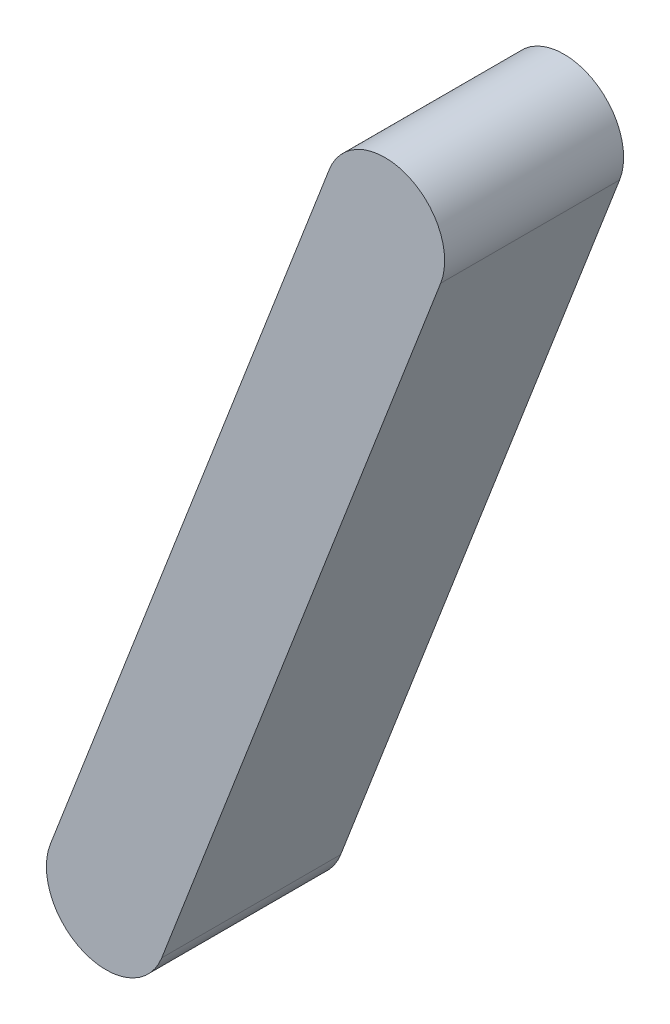
ISO-10303-21;
HEADER;
FILE_DESCRIPTION(('STEP AP214'),'2;1');
FILE_NAME('part.step','',(''),(''),'','','');
FILE_SCHEMA(('AUTOMOTIVE_DESIGN { 1 0 10303 214 1 1 1 1 }'));
ENDSEC;
DATA;
#1=APPLICATION_CONTEXT('core data for automotive mechanical design processes');
#2=APPLICATION_PROTOCOL_DEFINITION('international standard','automotive_design',2000,#1);
#3=PRODUCT_CONTEXT('',#1,'mechanical');
#4=PRODUCT('Part','Part','',(#3));
#5=PRODUCT_RELATED_PRODUCT_CATEGORY('part','',(#4));
#6=PRODUCT_DEFINITION_FORMATION('','',#4);
#7=PRODUCT_DEFINITION_CONTEXT('part definition',#1,'design');
#8=PRODUCT_DEFINITION('design','',#6,#7);
#9=PRODUCT_DEFINITION_SHAPE('','',#8);
#10=(LENGTH_UNIT() NAMED_UNIT(*) SI_UNIT(.MILLI.,.METRE.));
#11=(NAMED_UNIT(*) PLANE_ANGLE_UNIT() SI_UNIT($,.RADIAN.));
#12=(NAMED_UNIT(*) SI_UNIT($,.STERADIAN.) SOLID_ANGLE_UNIT());
#13=UNCERTAINTY_MEASURE_WITH_UNIT(LENGTH_MEASURE(1.E-05),#10,'distance_accuracy_value','');
#14=(GEOMETRIC_REPRESENTATION_CONTEXT(3) GLOBAL_UNCERTAINTY_ASSIGNED_CONTEXT((#13)) GLOBAL_UNIT_ASSIGNED_CONTEXT((#10,
#11,#12)) REPRESENTATION_CONTEXT('',''));
#15=CARTESIAN_POINT('',(0.,0.,0.));
#16=DIRECTION('',(0.,0.,1.));
#17=DIRECTION('',(1.,0.,0.));
#18=AXIS2_PLACEMENT_3D('',#15,#16,#17);
#19=CARTESIAN_POINT('',(-17.2604125977252,-48.0176499051361,15.));
#20=DIRECTION('',(0.,0.,-1.));
#21=DIRECTION('',(-1.,0.,0.));
#22=AXIS2_PLACEMENT_3D('',#19,#20,#21);
#23=CYLINDRICAL_SURFACE('',#22,10.);
#24=CARTESIAN_POINT('',(-17.2604125977252,-48.0176499051361,-15.));
#25=DIRECTION('',(0.,0.,1.));
#26=DIRECTION('',(1.,0.,0.));
#27=AXIS2_PLACEMENT_3D('',#24,#25,#26);
#28=CIRCLE('',#27,10.);
#29=CARTESIAN_POINT('',(-26.5913391389211,-44.4212892609839,-15.));
#30=VERTEX_POINT('',#29);
#31=CARTESIAN_POINT('',(-7.92948605652935,-51.6140105492883,-15.));
#32=VERTEX_POINT('',#31);
#33=EDGE_CURVE('E95',#30,#32,#28,.T.);
#34=ORIENTED_EDGE('',*,*,#33,.T.);
#35=DIRECTION('',(0.,0.,-1.));
#36=VECTOR('',#35,1.);
#37=CARTESIAN_POINT('',(-7.92948605652935,-51.6140105492883,15.));
#38=LINE('',#37,#36);
#39=CARTESIAN_POINT('',(-7.92948605652935,-51.6140105492883,15.));
#40=VERTEX_POINT('',#39);
#41=EDGE_CURVE('E11',#40,#32,#38,.T.);
#42=ORIENTED_EDGE('',*,*,#41,.F.);
#43=CARTESIAN_POINT('',(-17.2604125977252,-48.0176499051361,15.));
#44=DIRECTION('',(0.,0.,1.));
#45=DIRECTION('',(1.,0.,0.));
#46=AXIS2_PLACEMENT_3D('',#43,#44,#45);
#47=CIRCLE('',#46,10.);
#48=CARTESIAN_POINT('',(-26.5913391389211,-44.4212892609839,15.));
#49=VERTEX_POINT('',#48);
#50=EDGE_CURVE('E83',#49,#40,#47,.T.);
#51=ORIENTED_EDGE('',*,*,#50,.F.);
#52=DIRECTION('',(0.,0.,-1.));
#53=VECTOR('',#52,1.);
#54=CARTESIAN_POINT('',(-26.5913391389211,-44.4212892609839,15.));
#55=LINE('',#54,#53);
#56=EDGE_CURVE('E91',#49,#30,#55,.T.);
#57=ORIENTED_EDGE('',*,*,#56,.T.);
#58=EDGE_LOOP('',(#34,#42,#51,#57));
#59=FACE_BOUND('',#58,.T.);
#60=ADVANCED_FACE('F32',(#59),#23,.T.);
#61=CARTESIAN_POINT('',(-7.92948605652935,-51.6140105492883,15.));
#62=DIRECTION('',(-0.933092654119586,0.359636064415218,0.));
#63=DIRECTION('',(-0.359636064415218,-0.933092654119586,0.));
#64=AXIS2_PLACEMENT_3D('',#61,#62,#63);
#65=PLANE('',#64);
#66=DIRECTION('',(0.359636064415218,0.933092654119586,0.));
#67=VECTOR('',#66,1.);
#68=CARTESIAN_POINT('',(-7.92948605652935,-51.6140105492883,-15.));
#69=LINE('',#68,#67);
#70=CARTESIAN_POINT('',(38.823202317449,69.6880344862579,-15.));
#71=VERTEX_POINT('',#70);
#72=EDGE_CURVE('E87',#32,#71,#69,.T.);
#73=ORIENTED_EDGE('',*,*,#72,.T.);
#74=DIRECTION('',(0.,0.,-1.));
#75=VECTOR('',#74,1.);
#76=CARTESIAN_POINT('',(38.823202317449,69.6880344862579,15.));
#77=LINE('',#76,#75);
#78=CARTESIAN_POINT('',(38.823202317449,69.6880344862579,15.));
#79=VERTEX_POINT('',#78);
#80=EDGE_CURVE('E40',#79,#71,#77,.T.);
#81=ORIENTED_EDGE('',*,*,#80,.F.);
#82=DIRECTION('',(0.359636064415218,0.933092654119586,0.));
#83=VECTOR('',#82,1.);
#84=CARTESIAN_POINT('',(-7.92948605652935,-51.6140105492883,15.));
#85=LINE('',#84,#83);
#86=EDGE_CURVE('E78',#40,#79,#85,.T.);
#87=ORIENTED_EDGE('',*,*,#86,.F.);
#88=ORIENTED_EDGE('',*,*,#41,.T.);
#89=EDGE_LOOP('',(#73,#81,#87,#88));
#90=FACE_BOUND('',#89,.T.);
#91=ADVANCED_FACE('F86',(#90),#65,.F.);
#92=CARTESIAN_POINT('',(29.4922757762531,73.2843951304101,15.));
#93=DIRECTION('',(0.,0.,-1.));
#94=DIRECTION('',(-1.,0.,0.));
#95=AXIS2_PLACEMENT_3D('',#92,#93,#94);
#96=CYLINDRICAL_SURFACE('',#95,9.99999999999999);
#97=CARTESIAN_POINT('',(29.4922757762531,73.2843951304101,-15.));
#98=DIRECTION('',(0.,0.,1.));
#99=DIRECTION('',(1.,0.,0.));
#100=AXIS2_PLACEMENT_3D('',#97,#98,#99);
#101=CIRCLE('',#100,9.99999999999999);
#102=CARTESIAN_POINT('',(20.1613492350573,76.8807557745623,-15.));
#103=VERTEX_POINT('',#102);
#104=EDGE_CURVE('E65',#71,#103,#101,.T.);
#105=ORIENTED_EDGE('',*,*,#104,.T.);
#106=DIRECTION('',(0.,0.,-1.));
#107=VECTOR('',#106,1.);
#108=CARTESIAN_POINT('',(20.1613492350573,76.8807557745623,15.));
#109=LINE('',#108,#107);
#110=CARTESIAN_POINT('',(20.1613492350573,76.8807557745623,15.));
#111=VERTEX_POINT('',#110);
#112=EDGE_CURVE('E88',#111,#103,#109,.T.);
#113=ORIENTED_EDGE('',*,*,#112,.F.);
#114=CARTESIAN_POINT('',(29.4922757762531,73.2843951304101,15.));
#115=DIRECTION('',(0.,0.,1.));
#116=DIRECTION('',(1.,0.,0.));
#117=AXIS2_PLACEMENT_3D('',#114,#115,#116);
#118=CIRCLE('',#117,9.99999999999999);
#119=EDGE_CURVE('E81',#79,#111,#118,.T.);
#120=ORIENTED_EDGE('',*,*,#119,.F.);
#121=ORIENTED_EDGE('',*,*,#80,.T.);
#122=EDGE_LOOP('',(#105,#113,#120,#121));
#123=FACE_BOUND('',#122,.T.);
#124=ADVANCED_FACE('F89',(#123),#96,.T.);
#125=CARTESIAN_POINT('',(-26.5913391389211,-44.4212892609839,15.));
#126=DIRECTION('',(0.933092654119586,-0.359636064415218,0.));
#127=DIRECTION('',(0.359636064415218,0.933092654119586,0.));
#128=AXIS2_PLACEMENT_3D('',#125,#126,#127);
#129=PLANE('',#128);
#130=DIRECTION('',(-0.359636064415218,-0.933092654119586,0.));
#131=VECTOR('',#130,1.);
#132=CARTESIAN_POINT('',(-26.5913391389211,-44.4212892609839,-15.));
#133=LINE('',#132,#131);
#134=EDGE_CURVE('E71',#103,#30,#133,.T.);
#135=ORIENTED_EDGE('',*,*,#134,.T.);
#136=ORIENTED_EDGE('',*,*,#56,.F.);
#137=DIRECTION('',(-0.359636064415218,-0.933092654119586,0.));
#138=VECTOR('',#137,1.);
#139=CARTESIAN_POINT('',(-26.5913391389211,-44.4212892609839,15.));
#140=LINE('',#139,#138);
#141=EDGE_CURVE('E48',#111,#49,#140,.T.);
#142=ORIENTED_EDGE('',*,*,#141,.F.);
#143=ORIENTED_EDGE('',*,*,#112,.T.);
#144=EDGE_LOOP('',(#135,#136,#142,#143));
#145=FACE_BOUND('',#144,.T.);
#146=ADVANCED_FACE('F102',(#145),#129,.F.);
#147=CARTESIAN_POINT('',(-17.2604125977252,-48.0176499051361,15.));
#148=DIRECTION('',(0.,0.,1.));
#149=DIRECTION('',(1.,0.,0.));
#150=AXIS2_PLACEMENT_3D('',#147,#148,#149);
#151=PLANE('',#150);
#152=ORIENTED_EDGE('',*,*,#50,.T.);
#153=ORIENTED_EDGE('',*,*,#86,.T.);
#154=ORIENTED_EDGE('',*,*,#119,.T.);
#155=ORIENTED_EDGE('',*,*,#141,.T.);
#156=EDGE_LOOP('',(#152,#153,#154,#155));
#157=FACE_BOUND('',#156,.T.);
#158=ADVANCED_FACE('F79',(#157),#151,.T.);
#159=CARTESIAN_POINT('',(-17.2604125977252,-48.0176499051361,-15.));
#160=DIRECTION('',(0.,0.,1.));
#161=DIRECTION('',(1.,0.,0.));
#162=AXIS2_PLACEMENT_3D('',#159,#160,#161);
#163=PLANE('',#162);
#164=ORIENTED_EDGE('',*,*,#33,.F.);
#165=ORIENTED_EDGE('',*,*,#134,.F.);
#166=ORIENTED_EDGE('',*,*,#104,.F.);
#167=ORIENTED_EDGE('',*,*,#72,.F.);
#168=EDGE_LOOP('',(#164,#165,#166,#167));
#169=FACE_BOUND('',#168,.T.);
#170=ADVANCED_FACE('F105',(#169),#163,.F.);
#171=CLOSED_SHELL('',(#60,#91,#124,#146,#158,#170));
#172=MANIFOLD_SOLID_BREP('B2',#171);
#173=ADVANCED_BREP_SHAPE_REPRESENTATION('',(#18,#172),#14);
#174=SHAPE_DEFINITION_REPRESENTATION(#9,#173);
ENDSEC;
END-ISO-10303-21;
